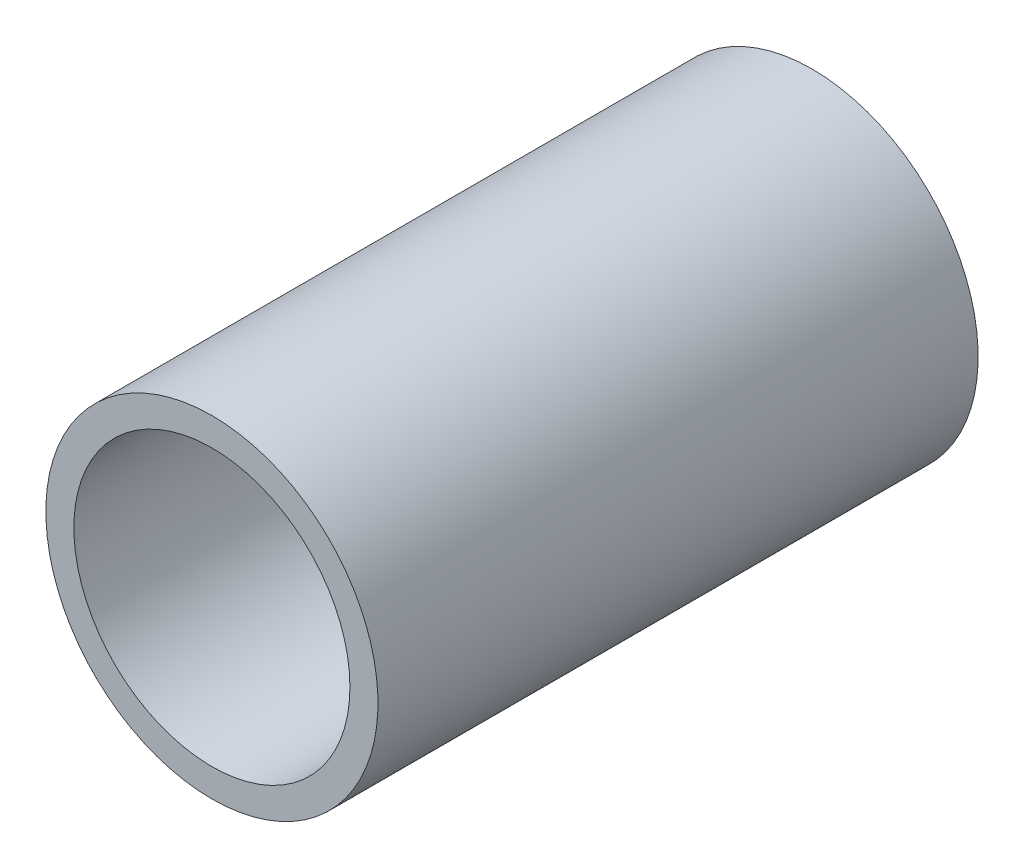
ISO-10303-21;
HEADER;
FILE_DESCRIPTION(('STEP AP214'),'2;1');
FILE_NAME('part.step','',(''),(''),'','','');
FILE_SCHEMA(('AUTOMOTIVE_DESIGN { 1 0 10303 214 1 1 1 1 }'));
ENDSEC;
DATA;
#1=APPLICATION_CONTEXT('core data for automotive mechanical design processes');
#2=APPLICATION_PROTOCOL_DEFINITION('international standard','automotive_design',2000,#1);
#3=PRODUCT_CONTEXT('',#1,'mechanical');
#4=PRODUCT('Part','Part','',(#3));
#5=PRODUCT_RELATED_PRODUCT_CATEGORY('part','',(#4));
#6=PRODUCT_DEFINITION_FORMATION('','',#4);
#7=PRODUCT_DEFINITION_CONTEXT('part definition',#1,'design');
#8=PRODUCT_DEFINITION('design','',#6,#7);
#9=PRODUCT_DEFINITION_SHAPE('','',#8);
#10=(LENGTH_UNIT() NAMED_UNIT(*) SI_UNIT(.MILLI.,.METRE.));
#11=(NAMED_UNIT(*) PLANE_ANGLE_UNIT() SI_UNIT($,.RADIAN.));
#12=(NAMED_UNIT(*) SI_UNIT($,.STERADIAN.) SOLID_ANGLE_UNIT());
#13=UNCERTAINTY_MEASURE_WITH_UNIT(LENGTH_MEASURE(1.E-05),#10,'distance_accuracy_value','');
#14=(GEOMETRIC_REPRESENTATION_CONTEXT(3) GLOBAL_UNCERTAINTY_ASSIGNED_CONTEXT((#13)) GLOBAL_UNIT_ASSIGNED_CONTEXT((#10,
#11,#12)) REPRESENTATION_CONTEXT('',''));
#15=CARTESIAN_POINT('',(0.,0.,0.));
#16=DIRECTION('',(0.,0.,1.));
#17=DIRECTION('',(1.,0.,0.));
#18=AXIS2_PLACEMENT_3D('',#15,#16,#17);
#19=CARTESIAN_POINT('',(0.,0.,0.));
#20=DIRECTION('',(0.,0.,1.));
#21=DIRECTION('',(1.,0.,0.));
#22=AXIS2_PLACEMENT_3D('',#19,#20,#21);
#23=CYLINDRICAL_SURFACE('',#22,17.526);
#24=CARTESIAN_POINT('',(0.,0.,76.2));
#25=DIRECTION('',(0.,0.,1.));
#26=DIRECTION('',(1.,0.,0.));
#27=AXIS2_PLACEMENT_3D('',#24,#25,#26);
#28=CIRCLE('',#27,17.526);
#29=CARTESIAN_POINT('',(17.526,0.,76.2));
#30=VERTEX_POINT('',#29);
#31=EDGE_CURVE('E9',#30,#30,#28,.T.);
#32=ORIENTED_EDGE('',*,*,#31,.T.);
#33=EDGE_LOOP('',(#32));
#34=FACE_BOUND('',#33,.T.);
#35=CARTESIAN_POINT('',(0.,0.,0.));
#36=DIRECTION('',(0.,0.,1.));
#37=DIRECTION('',(1.,0.,0.));
#38=AXIS2_PLACEMENT_3D('',#35,#36,#37);
#39=CIRCLE('',#38,17.526);
#40=CARTESIAN_POINT('',(17.526,0.,0.));
#41=VERTEX_POINT('',#40);
#42=EDGE_CURVE('E28',#41,#41,#39,.T.);
#43=ORIENTED_EDGE('',*,*,#42,.F.);
#44=EDGE_LOOP('',(#43));
#45=FACE_BOUND('',#44,.T.);
#46=ADVANCED_FACE('F14',(#34,#45),#23,.F.);
#47=CARTESIAN_POINT('',(0.,0.,0.));
#48=DIRECTION('',(0.,0.,1.));
#49=DIRECTION('',(1.,0.,0.));
#50=AXIS2_PLACEMENT_3D('',#47,#48,#49);
#51=CYLINDRICAL_SURFACE('',#50,21.082);
#52=CARTESIAN_POINT('',(0.,0.,76.2));
#53=DIRECTION('',(0.,0.,-1.));
#54=DIRECTION('',(0.,-1.,0.));
#55=AXIS2_PLACEMENT_3D('',#52,#53,#54);
#56=CIRCLE('',#55,21.082);
#57=CARTESIAN_POINT('',(0.,-21.082,76.2));
#58=VERTEX_POINT('',#57);
#59=EDGE_CURVE('E22',#58,#58,#56,.T.);
#60=ORIENTED_EDGE('',*,*,#59,.T.);
#61=EDGE_LOOP('',(#60));
#62=FACE_BOUND('',#61,.T.);
#63=CARTESIAN_POINT('',(0.,0.,0.));
#64=DIRECTION('',(0.,0.,-1.));
#65=DIRECTION('',(0.,-1.,0.));
#66=AXIS2_PLACEMENT_3D('',#63,#64,#65);
#67=CIRCLE('',#66,21.082);
#68=CARTESIAN_POINT('',(0.,-21.082,0.));
#69=VERTEX_POINT('',#68);
#70=EDGE_CURVE('E18',#69,#69,#67,.T.);
#71=ORIENTED_EDGE('',*,*,#70,.F.);
#72=EDGE_LOOP('',(#71));
#73=FACE_BOUND('',#72,.T.);
#74=ADVANCED_FACE('F16',(#62,#73),#51,.T.);
#75=CARTESIAN_POINT('',(0.,0.,0.));
#76=DIRECTION('',(0.,0.,1.));
#77=DIRECTION('',(1.,0.,0.));
#78=AXIS2_PLACEMENT_3D('',#75,#76,#77);
#79=PLANE('',#78);
#80=ORIENTED_EDGE('',*,*,#70,.T.);
#81=EDGE_LOOP('',(#80));
#82=FACE_BOUND('',#81,.T.);
#83=ORIENTED_EDGE('',*,*,#42,.T.);
#84=EDGE_LOOP('',(#83));
#85=FACE_BOUND('',#84,.T.);
#86=ADVANCED_FACE('F35',(#82,#85),#79,.F.);
#87=CARTESIAN_POINT('',(0.,0.,76.2));
#88=DIRECTION('',(0.,0.,1.));
#89=DIRECTION('',(1.,0.,0.));
#90=AXIS2_PLACEMENT_3D('',#87,#88,#89);
#91=PLANE('',#90);
#92=ORIENTED_EDGE('',*,*,#59,.F.);
#93=EDGE_LOOP('',(#92));
#94=FACE_BOUND('',#93,.T.);
#95=ORIENTED_EDGE('',*,*,#31,.F.);
#96=EDGE_LOOP('',(#95));
#97=FACE_BOUND('',#96,.T.);
#98=ADVANCED_FACE('F44',(#94,#97),#91,.T.);
#99=CLOSED_SHELL('',(#46,#74,#86,#98));
#100=MANIFOLD_SOLID_BREP('B1',#99);
#101=ADVANCED_BREP_SHAPE_REPRESENTATION('',(#18,#100),#14);
#102=SHAPE_DEFINITION_REPRESENTATION(#9,#101);
ENDSEC;
END-ISO-10303-21;
